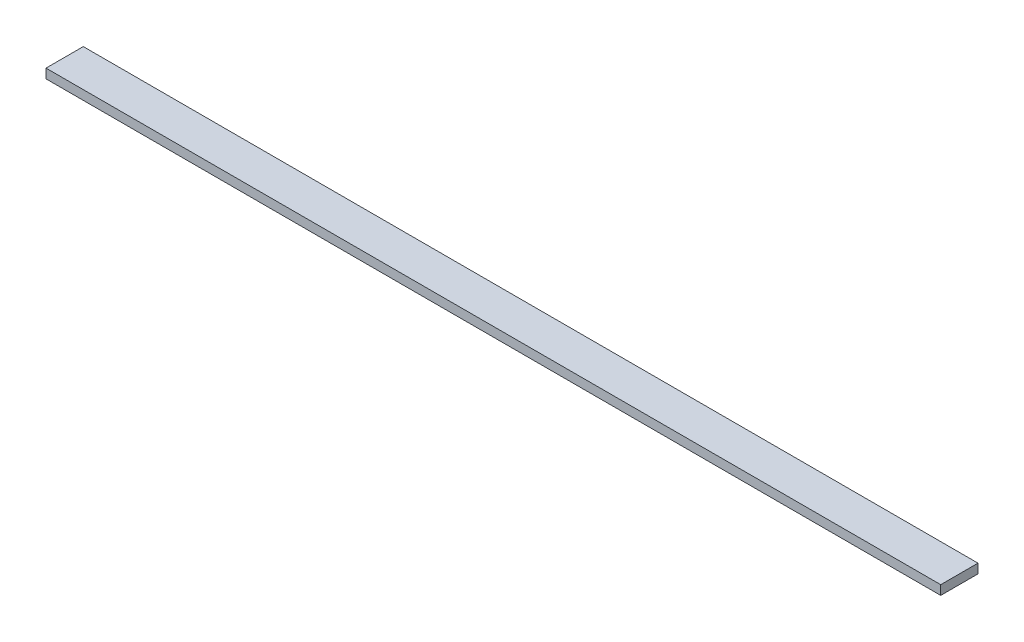
ISO-10303-21;
HEADER;
FILE_DESCRIPTION(('STEP AP214'),'2;1');
FILE_NAME('part.step','',(''),(''),'','','');
FILE_SCHEMA(('AUTOMOTIVE_DESIGN { 1 0 10303 214 1 1 1 1 }'));
ENDSEC;
DATA;
#1=APPLICATION_CONTEXT('core data for automotive mechanical design processes');
#2=APPLICATION_PROTOCOL_DEFINITION('international standard','automotive_design',2000,#1);
#3=PRODUCT_CONTEXT('',#1,'mechanical');
#4=PRODUCT('Part','Part','',(#3));
#5=PRODUCT_RELATED_PRODUCT_CATEGORY('part','',(#4));
#6=PRODUCT_DEFINITION_FORMATION('','',#4);
#7=PRODUCT_DEFINITION_CONTEXT('part definition',#1,'design');
#8=PRODUCT_DEFINITION('design','',#6,#7);
#9=PRODUCT_DEFINITION_SHAPE('','',#8);
#10=(LENGTH_UNIT() NAMED_UNIT(*) SI_UNIT(.MILLI.,.METRE.));
#11=(NAMED_UNIT(*) PLANE_ANGLE_UNIT() SI_UNIT($,.RADIAN.));
#12=(NAMED_UNIT(*) SI_UNIT($,.STERADIAN.) SOLID_ANGLE_UNIT());
#13=UNCERTAINTY_MEASURE_WITH_UNIT(LENGTH_MEASURE(1.E-05),#10,'distance_accuracy_value','');
#14=(GEOMETRIC_REPRESENTATION_CONTEXT(3) GLOBAL_UNCERTAINTY_ASSIGNED_CONTEXT((#13)) GLOBAL_UNIT_ASSIGNED_CONTEXT((#10,
#11,#12)) REPRESENTATION_CONTEXT('',''));
#15=CARTESIAN_POINT('',(0.,0.,0.));
#16=DIRECTION('',(0.,0.,1.));
#17=DIRECTION('',(1.,0.,0.));
#18=AXIS2_PLACEMENT_3D('',#15,#16,#17);
#19=CARTESIAN_POINT('',(152.4,3.17499999999991,6.35));
#20=DIRECTION('',(-1.,0.,0.));
#21=DIRECTION('',(0.,0.,1.));
#22=AXIS2_PLACEMENT_3D('',#19,#20,#21);
#23=PLANE('',#22);
#24=DIRECTION('',(0.,0.,-1.));
#25=VECTOR('',#24,1.);
#26=CARTESIAN_POINT('',(152.4,0.,6.35));
#27=LINE('',#26,#25);
#28=CARTESIAN_POINT('',(152.4,0.,6.35));
#29=VERTEX_POINT('',#28);
#30=CARTESIAN_POINT('',(152.4,0.,-6.35));
#31=VERTEX_POINT('',#30);
#32=EDGE_CURVE('E121',#29,#31,#27,.T.);
#33=ORIENTED_EDGE('',*,*,#32,.T.);
#34=DIRECTION('',(0.,-1.,0.));
#35=VECTOR('',#34,1.);
#36=CARTESIAN_POINT('',(152.4,3.17499999999991,-6.35));
#37=LINE('',#36,#35);
#38=CARTESIAN_POINT('',(152.4,3.17499999999991,-6.35));
#39=VERTEX_POINT('',#38);
#40=EDGE_CURVE('E11',#39,#31,#37,.T.);
#41=ORIENTED_EDGE('',*,*,#40,.F.);
#42=DIRECTION('',(0.,0.,-1.));
#43=VECTOR('',#42,1.);
#44=CARTESIAN_POINT('',(152.4,3.17499999999991,6.35));
#45=LINE('',#44,#43);
#46=CARTESIAN_POINT('',(152.4,3.17499999999991,6.35));
#47=VERTEX_POINT('',#46);
#48=EDGE_CURVE('E102',#47,#39,#45,.T.);
#49=ORIENTED_EDGE('',*,*,#48,.F.);
#50=DIRECTION('',(0.,-1.,0.));
#51=VECTOR('',#50,1.);
#52=CARTESIAN_POINT('',(152.4,3.17499999999991,6.35));
#53=LINE('',#52,#51);
#54=EDGE_CURVE('E117',#47,#29,#53,.T.);
#55=ORIENTED_EDGE('',*,*,#54,.T.);
#56=EDGE_LOOP('',(#33,#41,#49,#55));
#57=FACE_BOUND('',#56,.T.);
#58=ADVANCED_FACE('F42',(#57),#23,.F.);
#59=CARTESIAN_POINT('',(-152.4,3.17500000000001,-6.35000000000001));
#60=DIRECTION('',(0.,0.,1.));
#61=DIRECTION('',(1.,0.,0.));
#62=AXIS2_PLACEMENT_3D('',#59,#60,#61);
#63=PLANE('',#62);
#64=DIRECTION('',(-1.,0.,0.));
#65=VECTOR('',#64,1.);
#66=CARTESIAN_POINT('',(-152.4,-1.66533453693773E-13,-6.35));
#67=LINE('',#66,#65);
#68=CARTESIAN_POINT('',(-152.4,-1.66533453693773E-13,-6.35));
#69=VERTEX_POINT('',#68);
#70=EDGE_CURVE('E107',#31,#69,#67,.T.);
#71=ORIENTED_EDGE('',*,*,#70,.T.);
#72=DIRECTION('',(0.,-1.,0.));
#73=VECTOR('',#72,1.);
#74=CARTESIAN_POINT('',(-152.4,3.17500000000001,-6.35000000000001));
#75=LINE('',#74,#73);
#76=CARTESIAN_POINT('',(-152.4,3.17500000000001,-6.35000000000001));
#77=VERTEX_POINT('',#76);
#78=EDGE_CURVE('E51',#77,#69,#75,.T.);
#79=ORIENTED_EDGE('',*,*,#78,.F.);
#80=DIRECTION('',(-1.,0.,0.));
#81=VECTOR('',#80,1.);
#82=CARTESIAN_POINT('',(-152.4,3.17500000000001,-6.35000000000001));
#83=LINE('',#82,#81);
#84=EDGE_CURVE('E97',#39,#77,#83,.T.);
#85=ORIENTED_EDGE('',*,*,#84,.F.);
#86=ORIENTED_EDGE('',*,*,#40,.T.);
#87=EDGE_LOOP('',(#71,#79,#85,#86));
#88=FACE_BOUND('',#87,.T.);
#89=ADVANCED_FACE('F106',(#88),#63,.F.);
#90=CARTESIAN_POINT('',(-152.4,3.17500000000001,6.34999999999999));
#91=DIRECTION('',(1.,0.,0.));
#92=DIRECTION('',(0.,0.,-1.));
#93=AXIS2_PLACEMENT_3D('',#90,#91,#92);
#94=PLANE('',#93);
#95=DIRECTION('',(0.,0.,1.));
#96=VECTOR('',#95,1.);
#97=CARTESIAN_POINT('',(-152.4,-1.66533453693773E-13,6.35));
#98=LINE('',#97,#96);
#99=CARTESIAN_POINT('',(-152.4,-1.66533453693773E-13,6.35));
#100=VERTEX_POINT('',#99);
#101=EDGE_CURVE('E82',#69,#100,#98,.T.);
#102=ORIENTED_EDGE('',*,*,#101,.T.);
#103=DIRECTION('',(0.,-1.,0.));
#104=VECTOR('',#103,1.);
#105=CARTESIAN_POINT('',(-152.4,3.17500000000001,6.34999999999999));
#106=LINE('',#105,#104);
#107=CARTESIAN_POINT('',(-152.4,3.17500000000001,6.34999999999999));
#108=VERTEX_POINT('',#107);
#109=EDGE_CURVE('E109',#108,#100,#106,.T.);
#110=ORIENTED_EDGE('',*,*,#109,.F.);
#111=DIRECTION('',(0.,0.,1.));
#112=VECTOR('',#111,1.);
#113=CARTESIAN_POINT('',(-152.4,3.17500000000001,6.34999999999999));
#114=LINE('',#113,#112);
#115=EDGE_CURVE('E100',#77,#108,#114,.T.);
#116=ORIENTED_EDGE('',*,*,#115,.F.);
#117=ORIENTED_EDGE('',*,*,#78,.T.);
#118=EDGE_LOOP('',(#102,#110,#116,#117));
#119=FACE_BOUND('',#118,.T.);
#120=ADVANCED_FACE('F110',(#119),#94,.F.);
#121=CARTESIAN_POINT('',(-152.4,3.17500000000001,6.34999999999999));
#122=DIRECTION('',(0.,0.,-1.));
#123=DIRECTION('',(-1.,0.,0.));
#124=AXIS2_PLACEMENT_3D('',#121,#122,#123);
#125=PLANE('',#124);
#126=DIRECTION('',(1.,0.,0.));
#127=VECTOR('',#126,1.);
#128=CARTESIAN_POINT('',(-152.4,-1.66533453693773E-13,6.35));
#129=LINE('',#128,#127);
#130=EDGE_CURVE('E89',#100,#29,#129,.T.);
#131=ORIENTED_EDGE('',*,*,#130,.T.);
#132=ORIENTED_EDGE('',*,*,#54,.F.);
#133=DIRECTION('',(1.,0.,0.));
#134=VECTOR('',#133,1.);
#135=CARTESIAN_POINT('',(-152.4,3.17500000000001,6.34999999999999));
#136=LINE('',#135,#134);
#137=EDGE_CURVE('E62',#108,#47,#136,.T.);
#138=ORIENTED_EDGE('',*,*,#137,.F.);
#139=ORIENTED_EDGE('',*,*,#109,.T.);
#140=EDGE_LOOP('',(#131,#132,#138,#139));
#141=FACE_BOUND('',#140,.T.);
#142=ADVANCED_FACE('F133',(#141),#125,.F.);
#143=CARTESIAN_POINT('',(0.,3.17499999999991,0.));
#144=DIRECTION('',(0.,-1.,0.));
#145=DIRECTION('',(0.,0.,-1.));
#146=AXIS2_PLACEMENT_3D('',#143,#144,#145);
#147=PLANE('',#146);
#148=ORIENTED_EDGE('',*,*,#48,.T.);
#149=ORIENTED_EDGE('',*,*,#84,.T.);
#150=ORIENTED_EDGE('',*,*,#115,.T.);
#151=ORIENTED_EDGE('',*,*,#137,.T.);
#152=EDGE_LOOP('',(#148,#149,#150,#151));
#153=FACE_BOUND('',#152,.T.);
#154=ADVANCED_FACE('F98',(#153),#147,.F.);
#155=CARTESIAN_POINT('',(0.,0.,0.));
#156=DIRECTION('',(0.,-1.,0.));
#157=DIRECTION('',(0.,0.,-1.));
#158=AXIS2_PLACEMENT_3D('',#155,#156,#157);
#159=PLANE('',#158);
#160=ORIENTED_EDGE('',*,*,#32,.F.);
#161=ORIENTED_EDGE('',*,*,#130,.F.);
#162=ORIENTED_EDGE('',*,*,#101,.F.);
#163=ORIENTED_EDGE('',*,*,#70,.F.);
#164=EDGE_LOOP('',(#160,#161,#162,#163));
#165=FACE_BOUND('',#164,.T.);
#166=ADVANCED_FACE('F136',(#165),#159,.T.);
#167=CLOSED_SHELL('',(#58,#89,#120,#142,#154,#166));
#168=MANIFOLD_SOLID_BREP('B2',#167);
#169=ADVANCED_BREP_SHAPE_REPRESENTATION('',(#18,#168),#14);
#170=SHAPE_DEFINITION_REPRESENTATION(#9,#169);
ENDSEC;
END-ISO-10303-21;
